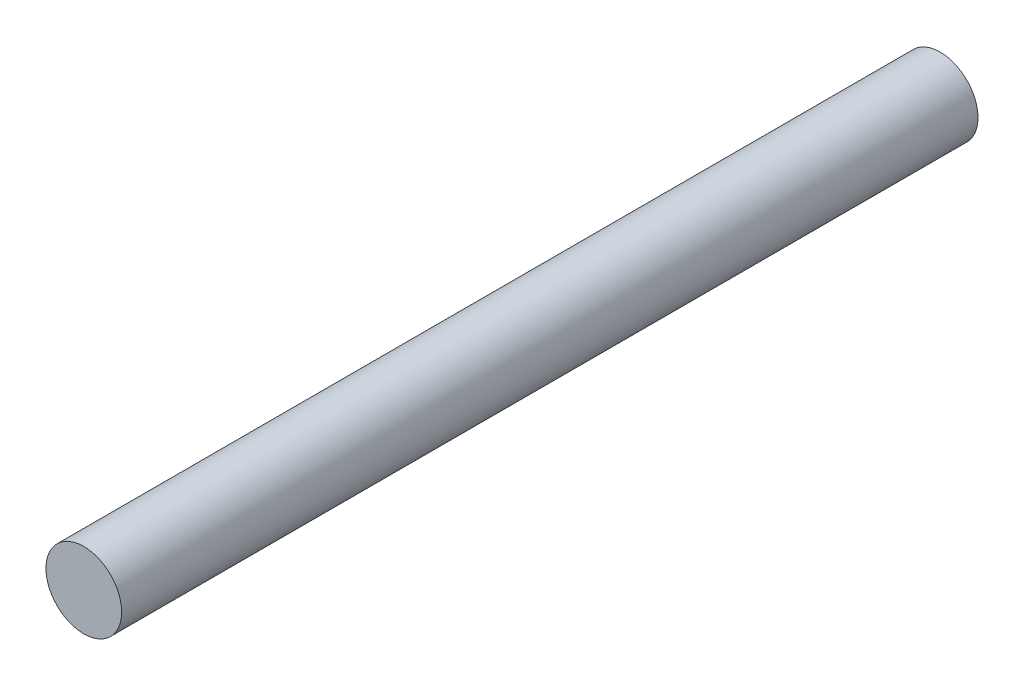
ISO-10303-21;
HEADER;
FILE_DESCRIPTION(('STEP AP214'),'2;1');
FILE_NAME('part.step','',(''),(''),'','','');
FILE_SCHEMA(('AUTOMOTIVE_DESIGN { 1 0 10303 214 1 1 1 1 }'));
ENDSEC;
DATA;
#1=APPLICATION_CONTEXT('core data for automotive mechanical design processes');
#2=APPLICATION_PROTOCOL_DEFINITION('international standard','automotive_design',2000,#1);
#3=PRODUCT_CONTEXT('',#1,'mechanical');
#4=PRODUCT('Part','Part','',(#3));
#5=PRODUCT_RELATED_PRODUCT_CATEGORY('part','',(#4));
#6=PRODUCT_DEFINITION_FORMATION('','',#4);
#7=PRODUCT_DEFINITION_CONTEXT('part definition',#1,'design');
#8=PRODUCT_DEFINITION('design','',#6,#7);
#9=PRODUCT_DEFINITION_SHAPE('','',#8);
#10=(LENGTH_UNIT() NAMED_UNIT(*) SI_UNIT(.MILLI.,.METRE.));
#11=(NAMED_UNIT(*) PLANE_ANGLE_UNIT() SI_UNIT($,.RADIAN.));
#12=(NAMED_UNIT(*) SI_UNIT($,.STERADIAN.) SOLID_ANGLE_UNIT());
#13=UNCERTAINTY_MEASURE_WITH_UNIT(LENGTH_MEASURE(1.E-05),#10,'distance_accuracy_value','');
#14=(GEOMETRIC_REPRESENTATION_CONTEXT(3) GLOBAL_UNCERTAINTY_ASSIGNED_CONTEXT((#13)) GLOBAL_UNIT_ASSIGNED_CONTEXT((#10,
#11,#12)) REPRESENTATION_CONTEXT('',''));
#15=CARTESIAN_POINT('',(0.,0.,0.));
#16=DIRECTION('',(0.,0.,1.));
#17=DIRECTION('',(1.,0.,0.));
#18=AXIS2_PLACEMENT_3D('',#15,#16,#17);
#19=CARTESIAN_POINT('',(0.,0.,55.));
#20=DIRECTION('',(0.,0.,-1.));
#21=DIRECTION('',(-1.,0.,0.));
#22=AXIS2_PLACEMENT_3D('',#19,#20,#21);
#23=CYLINDRICAL_SURFACE('',#22,4.8625);
#24=CARTESIAN_POINT('',(0.,0.,55.));
#25=DIRECTION('',(0.,0.,1.));
#26=DIRECTION('',(1.,0.,0.));
#27=AXIS2_PLACEMENT_3D('',#24,#25,#26);
#28=CIRCLE('',#27,4.8625);
#29=CARTESIAN_POINT('',(4.8625,0.,55.));
#30=VERTEX_POINT('',#29);
#31=EDGE_CURVE('E10',#30,#30,#28,.T.);
#32=ORIENTED_EDGE('',*,*,#31,.F.);
#33=EDGE_LOOP('',(#32));
#34=FACE_BOUND('',#33,.T.);
#35=CARTESIAN_POINT('',(0.,0.,-55.));
#36=DIRECTION('',(0.,0.,1.));
#37=DIRECTION('',(1.,0.,0.));
#38=AXIS2_PLACEMENT_3D('',#35,#36,#37);
#39=CIRCLE('',#38,4.8625);
#40=CARTESIAN_POINT('',(4.8625,0.,-55.));
#41=VERTEX_POINT('',#40);
#42=EDGE_CURVE('E36',#41,#41,#39,.T.);
#43=ORIENTED_EDGE('',*,*,#42,.T.);
#44=EDGE_LOOP('',(#43));
#45=FACE_BOUND('',#44,.T.);
#46=ADVANCED_FACE('F33',(#34,#45),#23,.T.);
#47=CARTESIAN_POINT('',(0.,0.,55.));
#48=DIRECTION('',(0.,0.,1.));
#49=DIRECTION('',(1.,0.,0.));
#50=AXIS2_PLACEMENT_3D('',#47,#48,#49);
#51=PLANE('',#50);
#52=ORIENTED_EDGE('',*,*,#31,.T.);
#53=EDGE_LOOP('',(#52));
#54=FACE_BOUND('',#53,.T.);
#55=ADVANCED_FACE('F48',(#54),#51,.T.);
#56=CARTESIAN_POINT('',(0.,0.,-55.));
#57=DIRECTION('',(0.,0.,1.));
#58=DIRECTION('',(1.,0.,0.));
#59=AXIS2_PLACEMENT_3D('',#56,#57,#58);
#60=PLANE('',#59);
#61=ORIENTED_EDGE('',*,*,#42,.F.);
#62=EDGE_LOOP('',(#61));
#63=FACE_BOUND('',#62,.T.);
#64=ADVANCED_FACE('F46',(#63),#60,.F.);
#65=CLOSED_SHELL('',(#46,#55,#64));
#66=MANIFOLD_SOLID_BREP('B2',#65);
#67=ADVANCED_BREP_SHAPE_REPRESENTATION('',(#18,#66),#14);
#68=SHAPE_DEFINITION_REPRESENTATION(#9,#67);
ENDSEC;
END-ISO-10303-21;
